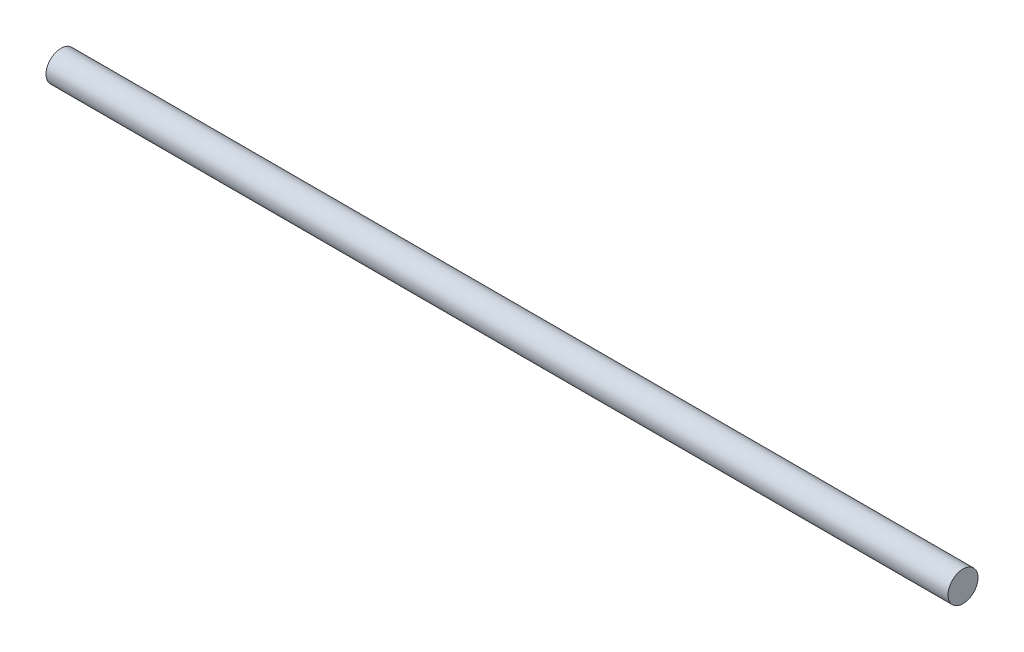
ISO-10303-21;
HEADER;
FILE_DESCRIPTION(('STEP AP214'),'2;1');
FILE_NAME('part.step','',(''),(''),'','','');
FILE_SCHEMA(('AUTOMOTIVE_DESIGN { 1 0 10303 214 1 1 1 1 }'));
ENDSEC;
DATA;
#1=APPLICATION_CONTEXT('core data for automotive mechanical design processes');
#2=APPLICATION_PROTOCOL_DEFINITION('international standard','automotive_design',2000,#1);
#3=PRODUCT_CONTEXT('',#1,'mechanical');
#4=PRODUCT('Part','Part','',(#3));
#5=PRODUCT_RELATED_PRODUCT_CATEGORY('part','',(#4));
#6=PRODUCT_DEFINITION_FORMATION('','',#4);
#7=PRODUCT_DEFINITION_CONTEXT('part definition',#1,'design');
#8=PRODUCT_DEFINITION('design','',#6,#7);
#9=PRODUCT_DEFINITION_SHAPE('','',#8);
#10=(LENGTH_UNIT() NAMED_UNIT(*) SI_UNIT(.MILLI.,.METRE.));
#11=(NAMED_UNIT(*) PLANE_ANGLE_UNIT() SI_UNIT($,.RADIAN.));
#12=(NAMED_UNIT(*) SI_UNIT($,.STERADIAN.) SOLID_ANGLE_UNIT());
#13=UNCERTAINTY_MEASURE_WITH_UNIT(LENGTH_MEASURE(1.E-05),#10,'distance_accuracy_value','');
#14=(GEOMETRIC_REPRESENTATION_CONTEXT(3) GLOBAL_UNCERTAINTY_ASSIGNED_CONTEXT((#13)) GLOBAL_UNIT_ASSIGNED_CONTEXT((#10,
#11,#12)) REPRESENTATION_CONTEXT('',''));
#15=CARTESIAN_POINT('',(0.,0.,0.));
#16=DIRECTION('',(0.,0.,1.));
#17=DIRECTION('',(1.,0.,0.));
#18=AXIS2_PLACEMENT_3D('',#15,#16,#17);
#19=CARTESIAN_POINT('',(0.,0.,0.));
#20=DIRECTION('',(1.,0.,0.));
#21=DIRECTION('',(0.,0.,-1.));
#22=AXIS2_PLACEMENT_3D('',#19,#20,#21);
#23=PLANE('',#22);
#24=CARTESIAN_POINT('',(0.,0.,0.));
#25=DIRECTION('',(-1.,0.,0.));
#26=DIRECTION('',(0.,0.,1.));
#27=AXIS2_PLACEMENT_3D('',#24,#25,#26);
#28=CIRCLE('',#27,0.5);
#29=CARTESIAN_POINT('',(0.,0.,0.5));
#30=VERTEX_POINT('',#29);
#31=EDGE_CURVE('E10',#30,#30,#28,.T.);
#32=ORIENTED_EDGE('',*,*,#31,.T.);
#33=EDGE_LOOP('',(#32));
#34=FACE_BOUND('',#33,.T.);
#35=ADVANCED_FACE('F32',(#34),#23,.F.);
#36=CARTESIAN_POINT('',(-126.458793885276,0.,0.));
#37=DIRECTION('',(-1.,0.,0.));
#38=DIRECTION('',(0.,0.,1.));
#39=AXIS2_PLACEMENT_3D('',#36,#37,#38);
#40=CYLINDRICAL_SURFACE('',#39,0.5);
#41=ORIENTED_EDGE('',*,*,#31,.F.);
#42=EDGE_LOOP('',(#41));
#43=FACE_BOUND('',#42,.T.);
#44=CARTESIAN_POINT('',(30.,0.,0.));
#45=DIRECTION('',(-1.,0.,0.));
#46=DIRECTION('',(0.,0.,1.));
#47=AXIS2_PLACEMENT_3D('',#44,#45,#46);
#48=CIRCLE('',#47,0.5);
#49=CARTESIAN_POINT('',(30.,0.,0.5));
#50=VERTEX_POINT('',#49);
#51=EDGE_CURVE('E38',#50,#50,#48,.T.);
#52=ORIENTED_EDGE('',*,*,#51,.T.);
#53=EDGE_LOOP('',(#52));
#54=FACE_BOUND('',#53,.T.);
#55=ADVANCED_FACE('F44',(#43,#54),#40,.T.);
#56=CARTESIAN_POINT('',(30.,0.5,0.));
#57=DIRECTION('',(-1.,0.,0.));
#58=DIRECTION('',(0.,0.,1.));
#59=AXIS2_PLACEMENT_3D('',#56,#57,#58);
#60=PLANE('',#59);
#61=ORIENTED_EDGE('',*,*,#51,.F.);
#62=EDGE_LOOP('',(#61));
#63=FACE_BOUND('',#62,.T.);
#64=ADVANCED_FACE('F46',(#63),#60,.F.);
#65=CLOSED_SHELL('',(#35,#55,#64));
#66=MANIFOLD_SOLID_BREP('B2',#65);
#67=ADVANCED_BREP_SHAPE_REPRESENTATION('',(#18,#66),#14);
#68=SHAPE_DEFINITION_REPRESENTATION(#9,#67);
ENDSEC;
END-ISO-10303-21;
